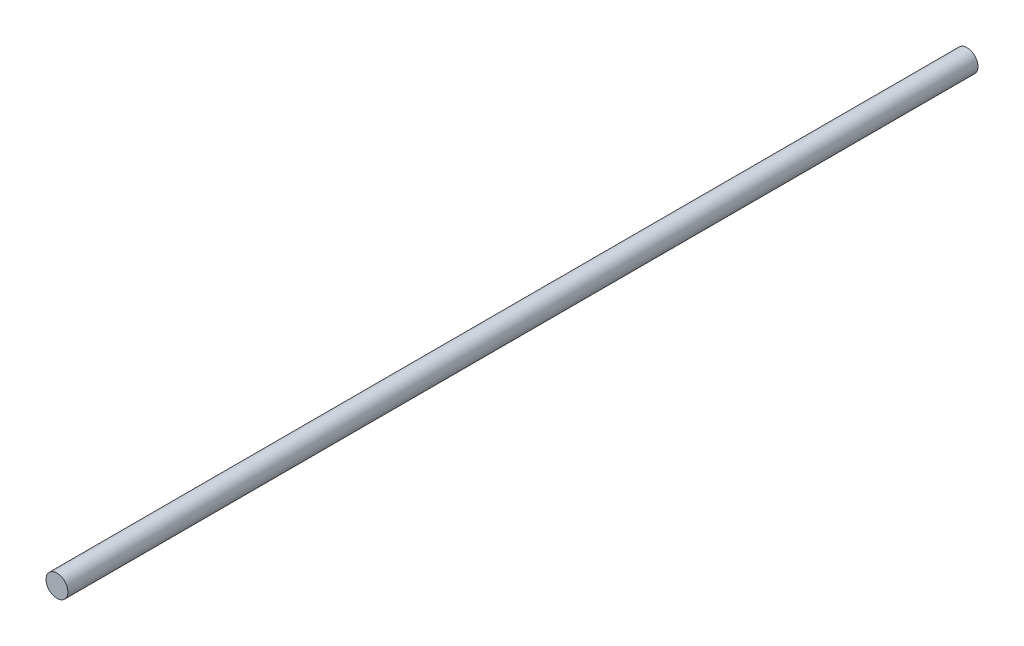
ISO-10303-21;
HEADER;
FILE_DESCRIPTION(('STEP AP214'),'2;1');
FILE_NAME('part.step','',(''),(''),'','','');
FILE_SCHEMA(('AUTOMOTIVE_DESIGN { 1 0 10303 214 1 1 1 1 }'));
ENDSEC;
DATA;
#1=APPLICATION_CONTEXT('core data for automotive mechanical design processes');
#2=APPLICATION_PROTOCOL_DEFINITION('international standard','automotive_design',2000,#1);
#3=PRODUCT_CONTEXT('',#1,'mechanical');
#4=PRODUCT('Part','Part','',(#3));
#5=PRODUCT_RELATED_PRODUCT_CATEGORY('part','',(#4));
#6=PRODUCT_DEFINITION_FORMATION('','',#4);
#7=PRODUCT_DEFINITION_CONTEXT('part definition',#1,'design');
#8=PRODUCT_DEFINITION('design','',#6,#7);
#9=PRODUCT_DEFINITION_SHAPE('','',#8);
#10=(LENGTH_UNIT() NAMED_UNIT(*) SI_UNIT(.MILLI.,.METRE.));
#11=(NAMED_UNIT(*) PLANE_ANGLE_UNIT() SI_UNIT($,.RADIAN.));
#12=(NAMED_UNIT(*) SI_UNIT($,.STERADIAN.) SOLID_ANGLE_UNIT());
#13=UNCERTAINTY_MEASURE_WITH_UNIT(LENGTH_MEASURE(1.E-05),#10,'distance_accuracy_value','');
#14=(GEOMETRIC_REPRESENTATION_CONTEXT(3) GLOBAL_UNCERTAINTY_ASSIGNED_CONTEXT((#13)) GLOBAL_UNIT_ASSIGNED_CONTEXT((#10,
#11,#12)) REPRESENTATION_CONTEXT('',''));
#15=CARTESIAN_POINT('',(0.,0.,0.));
#16=DIRECTION('',(0.,0.,1.));
#17=DIRECTION('',(1.,0.,0.));
#18=AXIS2_PLACEMENT_3D('',#15,#16,#17);
#19=CARTESIAN_POINT('',(0.,0.,527.05));
#20=DIRECTION('',(0.,0.,-1.));
#21=DIRECTION('',(-1.,0.,0.));
#22=AXIS2_PLACEMENT_3D('',#19,#20,#21);
#23=CYLINDRICAL_SURFACE('',#22,6.35);
#24=CARTESIAN_POINT('',(0.,0.,527.05));
#25=DIRECTION('',(0.,0.,1.));
#26=DIRECTION('',(1.,0.,0.));
#27=AXIS2_PLACEMENT_3D('',#24,#25,#26);
#28=CIRCLE('',#27,6.35);
#29=CARTESIAN_POINT('',(6.35,0.,527.05));
#30=VERTEX_POINT('',#29);
#31=EDGE_CURVE('E10',#30,#30,#28,.T.);
#32=ORIENTED_EDGE('',*,*,#31,.F.);
#33=EDGE_LOOP('',(#32));
#34=FACE_BOUND('',#33,.T.);
#35=CARTESIAN_POINT('',(0.,0.,0.));
#36=DIRECTION('',(0.,0.,1.));
#37=DIRECTION('',(1.,0.,0.));
#38=AXIS2_PLACEMENT_3D('',#35,#36,#37);
#39=CIRCLE('',#38,6.35);
#40=CARTESIAN_POINT('',(6.35,0.,0.));
#41=VERTEX_POINT('',#40);
#42=EDGE_CURVE('E33',#41,#41,#39,.T.);
#43=ORIENTED_EDGE('',*,*,#42,.T.);
#44=EDGE_LOOP('',(#43));
#45=FACE_BOUND('',#44,.T.);
#46=ADVANCED_FACE('F30',(#34,#45),#23,.T.);
#47=CARTESIAN_POINT('',(0.,0.,527.05));
#48=DIRECTION('',(0.,0.,1.));
#49=DIRECTION('',(1.,0.,0.));
#50=AXIS2_PLACEMENT_3D('',#47,#48,#49);
#51=PLANE('',#50);
#52=ORIENTED_EDGE('',*,*,#31,.T.);
#53=EDGE_LOOP('',(#52));
#54=FACE_BOUND('',#53,.T.);
#55=ADVANCED_FACE('F45',(#54),#51,.T.);
#56=CARTESIAN_POINT('',(0.,0.,0.));
#57=DIRECTION('',(0.,0.,1.));
#58=DIRECTION('',(1.,0.,0.));
#59=AXIS2_PLACEMENT_3D('',#56,#57,#58);
#60=PLANE('',#59);
#61=ORIENTED_EDGE('',*,*,#42,.F.);
#62=EDGE_LOOP('',(#61));
#63=FACE_BOUND('',#62,.T.);
#64=ADVANCED_FACE('F43',(#63),#60,.F.);
#65=CLOSED_SHELL('',(#46,#55,#64));
#66=MANIFOLD_SOLID_BREP('B2',#65);
#67=ADVANCED_BREP_SHAPE_REPRESENTATION('',(#18,#66),#14);
#68=SHAPE_DEFINITION_REPRESENTATION(#9,#67);
ENDSEC;
END-ISO-10303-21;
